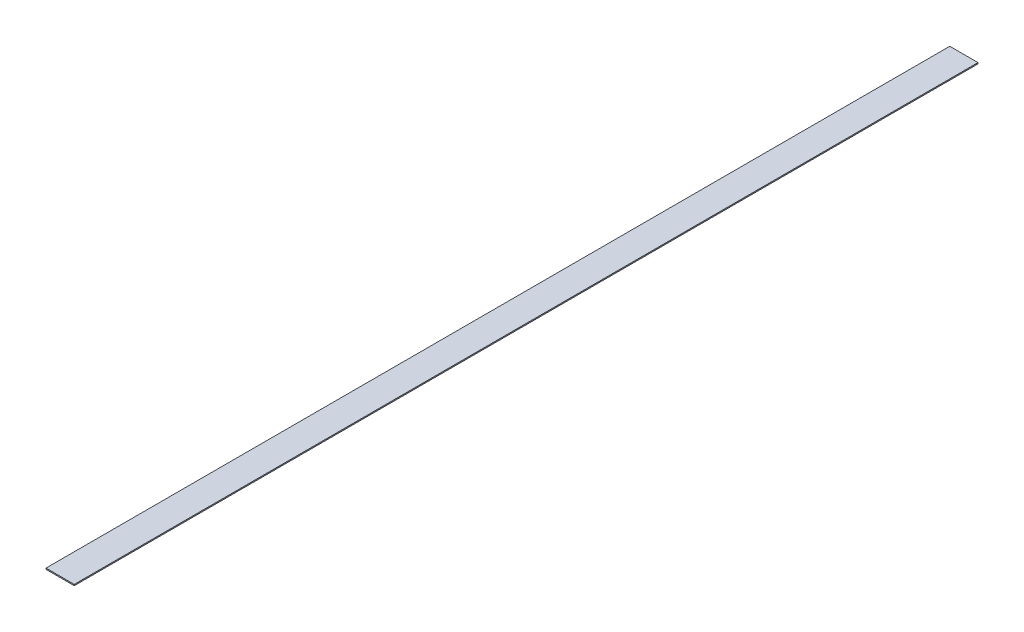
ISO-10303-21;
HEADER;
FILE_DESCRIPTION(('STEP AP214'),'2;1');
FILE_NAME('part.step','',(''),(''),'','','');
FILE_SCHEMA(('AUTOMOTIVE_DESIGN { 1 0 10303 214 1 1 1 1 }'));
ENDSEC;
DATA;
#1=APPLICATION_CONTEXT('core data for automotive mechanical design processes');
#2=APPLICATION_PROTOCOL_DEFINITION('international standard','automotive_design',2000,#1);
#3=PRODUCT_CONTEXT('',#1,'mechanical');
#4=PRODUCT('Part','Part','',(#3));
#5=PRODUCT_RELATED_PRODUCT_CATEGORY('part','',(#4));
#6=PRODUCT_DEFINITION_FORMATION('','',#4);
#7=PRODUCT_DEFINITION_CONTEXT('part definition',#1,'design');
#8=PRODUCT_DEFINITION('design','',#6,#7);
#9=PRODUCT_DEFINITION_SHAPE('','',#8);
#10=(LENGTH_UNIT() NAMED_UNIT(*) SI_UNIT(.MILLI.,.METRE.));
#11=(NAMED_UNIT(*) PLANE_ANGLE_UNIT() SI_UNIT($,.RADIAN.));
#12=(NAMED_UNIT(*) SI_UNIT($,.STERADIAN.) SOLID_ANGLE_UNIT());
#13=UNCERTAINTY_MEASURE_WITH_UNIT(LENGTH_MEASURE(1.E-05),#10,'distance_accuracy_value','');
#14=(GEOMETRIC_REPRESENTATION_CONTEXT(3) GLOBAL_UNCERTAINTY_ASSIGNED_CONTEXT((#13)) GLOBAL_UNIT_ASSIGNED_CONTEXT((#10,
#11,#12)) REPRESENTATION_CONTEXT('',''));
#15=CARTESIAN_POINT('',(0.,0.,0.));
#16=DIRECTION('',(0.,0.,1.));
#17=DIRECTION('',(1.,0.,0.));
#18=AXIS2_PLACEMENT_3D('',#15,#16,#17);
#19=CARTESIAN_POINT('',(-9.525,0.79375,-304.8));
#20=DIRECTION('',(1.,0.,0.));
#21=DIRECTION('',(0.,0.,-1.));
#22=AXIS2_PLACEMENT_3D('',#19,#20,#21);
#23=PLANE('',#22);
#24=DIRECTION('',(0.,0.,1.));
#25=VECTOR('',#24,1.);
#26=CARTESIAN_POINT('',(-9.525,0.,-304.8));
#27=LINE('',#26,#25);
#28=CARTESIAN_POINT('',(-9.525,0.,-304.8));
#29=VERTEX_POINT('',#28);
#30=CARTESIAN_POINT('',(-9.525,0.,304.8));
#31=VERTEX_POINT('',#30);
#32=EDGE_CURVE('E94',#29,#31,#27,.T.);
#33=ORIENTED_EDGE('',*,*,#32,.T.);
#34=DIRECTION('',(0.,-1.,0.));
#35=VECTOR('',#34,1.);
#36=CARTESIAN_POINT('',(-9.525,0.79375,304.8));
#37=LINE('',#36,#35);
#38=CARTESIAN_POINT('',(-9.525,0.79375,304.8));
#39=VERTEX_POINT('',#38);
#40=EDGE_CURVE('E11',#39,#31,#37,.T.);
#41=ORIENTED_EDGE('',*,*,#40,.F.);
#42=DIRECTION('',(0.,0.,1.));
#43=VECTOR('',#42,1.);
#44=CARTESIAN_POINT('',(-9.525,0.79375,-304.8));
#45=LINE('',#44,#43);
#46=CARTESIAN_POINT('',(-9.525,0.79375,-304.8));
#47=VERTEX_POINT('',#46);
#48=EDGE_CURVE('E82',#47,#39,#45,.T.);
#49=ORIENTED_EDGE('',*,*,#48,.F.);
#50=DIRECTION('',(0.,-1.,0.));
#51=VECTOR('',#50,1.);
#52=CARTESIAN_POINT('',(-9.525,0.79375,-304.8));
#53=LINE('',#52,#51);
#54=EDGE_CURVE('E90',#47,#29,#53,.T.);
#55=ORIENTED_EDGE('',*,*,#54,.T.);
#56=EDGE_LOOP('',(#33,#41,#49,#55));
#57=FACE_BOUND('',#56,.T.);
#58=ADVANCED_FACE('F31',(#57),#23,.F.);
#59=CARTESIAN_POINT('',(-9.525,0.79375,304.8));
#60=DIRECTION('',(0.,0.,-1.));
#61=DIRECTION('',(-1.,0.,0.));
#62=AXIS2_PLACEMENT_3D('',#59,#60,#61);
#63=PLANE('',#62);
#64=DIRECTION('',(1.,0.,0.));
#65=VECTOR('',#64,1.);
#66=CARTESIAN_POINT('',(-9.525,0.,304.8));
#67=LINE('',#66,#65);
#68=CARTESIAN_POINT('',(9.525,0.,304.8));
#69=VERTEX_POINT('',#68);
#70=EDGE_CURVE('E86',#31,#69,#67,.T.);
#71=ORIENTED_EDGE('',*,*,#70,.T.);
#72=DIRECTION('',(0.,-1.,0.));
#73=VECTOR('',#72,1.);
#74=CARTESIAN_POINT('',(9.525,0.79375,304.8));
#75=LINE('',#74,#73);
#76=CARTESIAN_POINT('',(9.525,0.79375,304.8));
#77=VERTEX_POINT('',#76);
#78=EDGE_CURVE('E39',#77,#69,#75,.T.);
#79=ORIENTED_EDGE('',*,*,#78,.F.);
#80=DIRECTION('',(1.,0.,0.));
#81=VECTOR('',#80,1.);
#82=CARTESIAN_POINT('',(-9.525,0.79375,304.8));
#83=LINE('',#82,#81);
#84=EDGE_CURVE('E77',#39,#77,#83,.T.);
#85=ORIENTED_EDGE('',*,*,#84,.F.);
#86=ORIENTED_EDGE('',*,*,#40,.T.);
#87=EDGE_LOOP('',(#71,#79,#85,#86));
#88=FACE_BOUND('',#87,.T.);
#89=ADVANCED_FACE('F85',(#88),#63,.F.);
#90=CARTESIAN_POINT('',(9.525,0.79375,-304.8));
#91=DIRECTION('',(-1.,0.,0.));
#92=DIRECTION('',(0.,0.,1.));
#93=AXIS2_PLACEMENT_3D('',#90,#91,#92);
#94=PLANE('',#93);
#95=DIRECTION('',(0.,0.,-1.));
#96=VECTOR('',#95,1.);
#97=CARTESIAN_POINT('',(9.525,0.,-304.8));
#98=LINE('',#97,#96);
#99=CARTESIAN_POINT('',(9.525,0.,-304.8));
#100=VERTEX_POINT('',#99);
#101=EDGE_CURVE('E64',#69,#100,#98,.T.);
#102=ORIENTED_EDGE('',*,*,#101,.T.);
#103=DIRECTION('',(0.,-1.,0.));
#104=VECTOR('',#103,1.);
#105=CARTESIAN_POINT('',(9.525,0.79375,-304.8));
#106=LINE('',#105,#104);
#107=CARTESIAN_POINT('',(9.525,0.79375,-304.8));
#108=VERTEX_POINT('',#107);
#109=EDGE_CURVE('E87',#108,#100,#106,.T.);
#110=ORIENTED_EDGE('',*,*,#109,.F.);
#111=DIRECTION('',(0.,0.,-1.));
#112=VECTOR('',#111,1.);
#113=CARTESIAN_POINT('',(9.525,0.79375,-304.8));
#114=LINE('',#113,#112);
#115=EDGE_CURVE('E80',#77,#108,#114,.T.);
#116=ORIENTED_EDGE('',*,*,#115,.F.);
#117=ORIENTED_EDGE('',*,*,#78,.T.);
#118=EDGE_LOOP('',(#102,#110,#116,#117));
#119=FACE_BOUND('',#118,.T.);
#120=ADVANCED_FACE('F88',(#119),#94,.F.);
#121=CARTESIAN_POINT('',(-9.525,0.79375,-304.8));
#122=DIRECTION('',(0.,0.,1.));
#123=DIRECTION('',(1.,0.,0.));
#124=AXIS2_PLACEMENT_3D('',#121,#122,#123);
#125=PLANE('',#124);
#126=DIRECTION('',(-1.,0.,0.));
#127=VECTOR('',#126,1.);
#128=CARTESIAN_POINT('',(-9.525,0.,-304.8));
#129=LINE('',#128,#127);
#130=EDGE_CURVE('E70',#100,#29,#129,.T.);
#131=ORIENTED_EDGE('',*,*,#130,.T.);
#132=ORIENTED_EDGE('',*,*,#54,.F.);
#133=DIRECTION('',(-1.,0.,0.));
#134=VECTOR('',#133,1.);
#135=CARTESIAN_POINT('',(-9.525,0.79375,-304.8));
#136=LINE('',#135,#134);
#137=EDGE_CURVE('E47',#108,#47,#136,.T.);
#138=ORIENTED_EDGE('',*,*,#137,.F.);
#139=ORIENTED_EDGE('',*,*,#109,.T.);
#140=EDGE_LOOP('',(#131,#132,#138,#139));
#141=FACE_BOUND('',#140,.T.);
#142=ADVANCED_FACE('F101',(#141),#125,.F.);
#143=CARTESIAN_POINT('',(-9.525,0.79375,304.8));
#144=DIRECTION('',(0.,1.,0.));
#145=DIRECTION('',(0.,0.,1.));
#146=AXIS2_PLACEMENT_3D('',#143,#144,#145);
#147=PLANE('',#146);
#148=ORIENTED_EDGE('',*,*,#48,.T.);
#149=ORIENTED_EDGE('',*,*,#84,.T.);
#150=ORIENTED_EDGE('',*,*,#115,.T.);
#151=ORIENTED_EDGE('',*,*,#137,.T.);
#152=EDGE_LOOP('',(#148,#149,#150,#151));
#153=FACE_BOUND('',#152,.T.);
#154=ADVANCED_FACE('F78',(#153),#147,.T.);
#155=CARTESIAN_POINT('',(-9.525,0.,304.8));
#156=DIRECTION('',(0.,1.,0.));
#157=DIRECTION('',(0.,0.,1.));
#158=AXIS2_PLACEMENT_3D('',#155,#156,#157);
#159=PLANE('',#158);
#160=ORIENTED_EDGE('',*,*,#32,.F.);
#161=ORIENTED_EDGE('',*,*,#130,.F.);
#162=ORIENTED_EDGE('',*,*,#101,.F.);
#163=ORIENTED_EDGE('',*,*,#70,.F.);
#164=EDGE_LOOP('',(#160,#161,#162,#163));
#165=FACE_BOUND('',#164,.T.);
#166=ADVANCED_FACE('F104',(#165),#159,.F.);
#167=CLOSED_SHELL('',(#58,#89,#120,#142,#154,#166));
#168=MANIFOLD_SOLID_BREP('B2',#167);
#169=ADVANCED_BREP_SHAPE_REPRESENTATION('',(#18,#168),#14);
#170=SHAPE_DEFINITION_REPRESENTATION(#9,#169);
ENDSEC;
END-ISO-10303-21;
